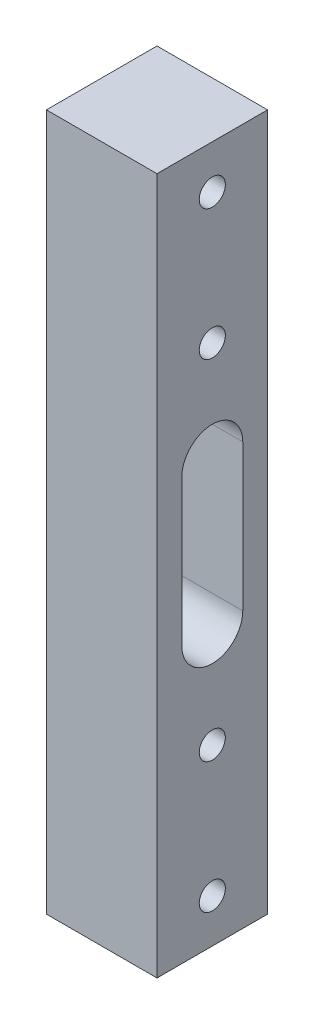
ISO-10303-21;
HEADER;
FILE_DESCRIPTION(('STEP AP214'),'2;1');
FILE_NAME('part.step','',(''),(''),'','','');
FILE_SCHEMA(('AUTOMOTIVE_DESIGN { 1 0 10303 214 1 1 1 1 }'));
ENDSEC;
DATA;
#1=APPLICATION_CONTEXT('core data for automotive mechanical design processes');
#2=APPLICATION_PROTOCOL_DEFINITION('international standard','automotive_design',2000,#1);
#3=PRODUCT_CONTEXT('',#1,'mechanical');
#4=PRODUCT('Part','Part','',(#3));
#5=PRODUCT_RELATED_PRODUCT_CATEGORY('part','',(#4));
#6=PRODUCT_DEFINITION_FORMATION('','',#4);
#7=PRODUCT_DEFINITION_CONTEXT('part definition',#1,'design');
#8=PRODUCT_DEFINITION('design','',#6,#7);
#9=PRODUCT_DEFINITION_SHAPE('','',#8);
#10=(LENGTH_UNIT() NAMED_UNIT(*) SI_UNIT(.MILLI.,.METRE.));
#11=(NAMED_UNIT(*) PLANE_ANGLE_UNIT() SI_UNIT($,.RADIAN.));
#12=(NAMED_UNIT(*) SI_UNIT($,.STERADIAN.) SOLID_ANGLE_UNIT());
#13=UNCERTAINTY_MEASURE_WITH_UNIT(LENGTH_MEASURE(1.E-05),#10,'distance_accuracy_value','');
#14=(GEOMETRIC_REPRESENTATION_CONTEXT(3) GLOBAL_UNCERTAINTY_ASSIGNED_CONTEXT((#13)) GLOBAL_UNIT_ASSIGNED_CONTEXT((#10,
#11,#12)) REPRESENTATION_CONTEXT('',''));
#15=CARTESIAN_POINT('',(0.,0.,0.));
#16=DIRECTION('',(0.,0.,1.));
#17=DIRECTION('',(1.,0.,0.));
#18=AXIS2_PLACEMENT_3D('',#15,#16,#17);
#19=CARTESIAN_POINT('',(280.436422298069,-4.67265995813977E-12,0.));
#20=DIRECTION('',(-1.,0.,0.));
#21=DIRECTION('',(0.,-1.,0.));
#22=AXIS2_PLACEMENT_3D('',#19,#20,#21);
#23=PLANE('',#22);
#24=CARTESIAN_POINT('',(280.436422298081,736.419008573429,-461.631063311423));
#25=DIRECTION('',(-1.,0.,0.));
#26=DIRECTION('',(0.,-1.,0.));
#27=AXIS2_PLACEMENT_3D('',#24,#25,#26);
#28=CIRCLE('',#27,1.50000000000002);
#29=CARTESIAN_POINT('',(280.436422298081,734.919008573429,-461.631063311423));
#30=VERTEX_POINT('',#29);
#31=EDGE_CURVE('E166',#30,#30,#28,.T.);
#32=ORIENTED_EDGE('',*,*,#31,.F.);
#33=EDGE_LOOP('',(#32));
#34=FACE_BOUND('',#33,.T.);
#35=CARTESIAN_POINT('',(280.436422298082,791.419008573429,-461.631063311423));
#36=DIRECTION('',(-1.,0.,0.));
#37=DIRECTION('',(0.,-1.,0.));
#38=AXIS2_PLACEMENT_3D('',#35,#36,#37);
#39=CIRCLE('',#38,1.49999999999999);
#40=CARTESIAN_POINT('',(280.436422298082,789.919008573429,-461.631063311423));
#41=VERTEX_POINT('',#40);
#42=EDGE_CURVE('E182',#41,#41,#39,.T.);
#43=ORIENTED_EDGE('',*,*,#42,.F.);
#44=EDGE_LOOP('',(#43));
#45=FACE_BOUND('',#44,.T.);
#46=DIRECTION('',(0.,-1.,0.));
#47=VECTOR('',#46,1.);
#48=CARTESIAN_POINT('',(280.436422298082,811.419008573429,-467.981063311423));
#49=LINE('',#48,#47);
#50=CARTESIAN_POINT('',(280.436422298082,811.419008573429,-467.981063311423));
#51=VERTEX_POINT('',#50);
#52=CARTESIAN_POINT('',(280.436422298081,731.419008573429,-467.981063311422));
#53=VERTEX_POINT('',#52);
#54=EDGE_CURVE('E190',#51,#53,#49,.T.);
#55=ORIENTED_EDGE('',*,*,#54,.T.);
#56=DIRECTION('',(0.,0.,1.));
#57=VECTOR('',#56,1.);
#58=CARTESIAN_POINT('',(280.436422298081,731.419008573429,-467.981063311422));
#59=LINE('',#58,#57);
#60=CARTESIAN_POINT('',(280.436422298081,731.419008573429,-455.281063311422));
#61=VERTEX_POINT('',#60);
#62=EDGE_CURVE('E194',#53,#61,#59,.T.);
#63=ORIENTED_EDGE('',*,*,#62,.T.);
#64=DIRECTION('',(0.,1.,0.));
#65=VECTOR('',#64,1.);
#66=CARTESIAN_POINT('',(280.436422298082,811.419008573429,-455.281063311422));
#67=LINE('',#66,#65);
#68=CARTESIAN_POINT('',(280.436422298082,811.419008573429,-455.281063311422));
#69=VERTEX_POINT('',#68);
#70=EDGE_CURVE('E198',#61,#69,#67,.T.);
#71=ORIENTED_EDGE('',*,*,#70,.T.);
#72=DIRECTION('',(0.,0.,-1.));
#73=VECTOR('',#72,1.);
#74=CARTESIAN_POINT('',(280.436422298082,811.419008573429,-467.981063311423));
#75=LINE('',#74,#73);
#76=EDGE_CURVE('E200',#69,#51,#75,.T.);
#77=ORIENTED_EDGE('',*,*,#76,.T.);
#78=EDGE_LOOP('',(#55,#63,#71,#77));
#79=FACE_BOUND('',#78,.T.);
#80=CARTESIAN_POINT('',(280.436422298082,806.419008573429,-461.631063311422));
#81=DIRECTION('',(-1.,0.,0.));
#82=DIRECTION('',(0.,-1.,0.));
#83=AXIS2_PLACEMENT_3D('',#80,#81,#82);
#84=CIRCLE('',#83,1.49999999999997);
#85=CARTESIAN_POINT('',(280.436422298082,804.919008573429,-461.631063311422));
#86=VERTEX_POINT('',#85);
#87=EDGE_CURVE('E174',#86,#86,#84,.T.);
#88=ORIENTED_EDGE('',*,*,#87,.F.);
#89=EDGE_LOOP('',(#88));
#90=FACE_BOUND('',#89,.T.);
#91=CARTESIAN_POINT('',(280.436422298081,751.419008573429,-461.631063311423));
#92=DIRECTION('',(-1.,0.,0.));
#93=DIRECTION('',(0.,-1.,0.));
#94=AXIS2_PLACEMENT_3D('',#91,#92,#93);
#95=CIRCLE('',#94,1.49999999999999);
#96=CARTESIAN_POINT('',(280.436422298081,749.919008573429,-461.631063311423));
#97=VERTEX_POINT('',#96);
#98=EDGE_CURVE('E158',#97,#97,#95,.T.);
#99=ORIENTED_EDGE('',*,*,#98,.F.);
#100=EDGE_LOOP('',(#99));
#101=FACE_BOUND('',#100,.T.);
#102=DIRECTION('',(0.,-1.,0.));
#103=VECTOR('',#102,1.);
#104=CARTESIAN_POINT('',(280.436422298082,779.824280891476,-465.131063311423));
#105=LINE('',#104,#103);
#106=CARTESIAN_POINT('',(280.436422298082,779.824280891476,-465.131063311423));
#107=VERTEX_POINT('',#106);
#108=CARTESIAN_POINT('',(280.436422298081,763.013736255382,-465.131063311422));
#109=VERTEX_POINT('',#108);
#110=EDGE_CURVE('E118',#107,#109,#105,.T.);
#111=ORIENTED_EDGE('',*,*,#110,.F.);
#112=CARTESIAN_POINT('',(280.436422298082,779.824280891476,-461.631063311422));
#113=DIRECTION('',(-1.,0.,0.));
#114=DIRECTION('',(0.,-1.,0.));
#115=AXIS2_PLACEMENT_3D('',#112,#113,#114);
#116=CIRCLE('',#115,3.5);
#117=CARTESIAN_POINT('',(280.436422298082,779.824280891476,-458.131063311423));
#118=VERTEX_POINT('',#117);
#119=EDGE_CURVE('E109',#118,#107,#116,.T.);
#120=ORIENTED_EDGE('',*,*,#119,.F.);
#121=DIRECTION('',(0.,1.,0.));
#122=VECTOR('',#121,1.);
#123=CARTESIAN_POINT('',(280.436422298082,779.824280891476,-458.131063311423));
#124=LINE('',#123,#122);
#125=CARTESIAN_POINT('',(280.436422298081,763.013736255382,-458.131063311423));
#126=VERTEX_POINT('',#125);
#127=EDGE_CURVE('E137',#126,#118,#124,.T.);
#128=ORIENTED_EDGE('',*,*,#127,.F.);
#129=CARTESIAN_POINT('',(280.436422298081,763.013736255382,-461.631063311422));
#130=DIRECTION('',(-1.,0.,0.));
#131=DIRECTION('',(0.,-1.,0.));
#132=AXIS2_PLACEMENT_3D('',#129,#130,#131);
#133=CIRCLE('',#132,3.5);
#134=EDGE_CURVE('E131',#109,#126,#133,.T.);
#135=ORIENTED_EDGE('',*,*,#134,.F.);
#136=EDGE_LOOP('',(#111,#120,#128,#135));
#137=FACE_BOUND('',#136,.T.);
#138=ADVANCED_FACE('F43',(#34,#45,#79,#90,#101,#137),#23,.T.);
#139=CARTESIAN_POINT('',(293.136422298069,-4.88170208087339E-12,0.));
#140=DIRECTION('',(-1.,0.,0.));
#141=DIRECTION('',(0.,-1.,0.));
#142=AXIS2_PLACEMENT_3D('',#139,#140,#141);
#143=PLANE('',#142);
#144=CARTESIAN_POINT('',(293.136422298081,751.419008573429,-461.631063311423));
#145=DIRECTION('',(-1.,0.,0.));
#146=DIRECTION('',(0.,-1.,0.));
#147=AXIS2_PLACEMENT_3D('',#144,#145,#146);
#148=CIRCLE('',#147,1.49999999999999);
#149=CARTESIAN_POINT('',(293.136422298081,749.919008573429,-461.631063311423));
#150=VERTEX_POINT('',#149);
#151=EDGE_CURVE('E127',#150,#150,#148,.T.);
#152=ORIENTED_EDGE('',*,*,#151,.T.);
#153=EDGE_LOOP('',(#152));
#154=FACE_BOUND('',#153,.T.);
#155=CARTESIAN_POINT('',(293.136422298081,736.419008573429,-461.631063311423));
#156=DIRECTION('',(-1.,0.,0.));
#157=DIRECTION('',(0.,-1.,0.));
#158=AXIS2_PLACEMENT_3D('',#155,#156,#157);
#159=CIRCLE('',#158,1.50000000000002);
#160=CARTESIAN_POINT('',(293.136422298081,734.919008573429,-461.631063311423));
#161=VERTEX_POINT('',#160);
#162=EDGE_CURVE('E162',#161,#161,#159,.T.);
#163=ORIENTED_EDGE('',*,*,#162,.T.);
#164=EDGE_LOOP('',(#163));
#165=FACE_BOUND('',#164,.T.);
#166=CARTESIAN_POINT('',(293.136422298082,806.419008573429,-461.631063311422));
#167=DIRECTION('',(-1.,0.,0.));
#168=DIRECTION('',(0.,-1.,0.));
#169=AXIS2_PLACEMENT_3D('',#166,#167,#168);
#170=CIRCLE('',#169,1.49999999999997);
#171=CARTESIAN_POINT('',(293.136422298082,804.919008573429,-461.631063311422));
#172=VERTEX_POINT('',#171);
#173=EDGE_CURVE('E170',#172,#172,#170,.T.);
#174=ORIENTED_EDGE('',*,*,#173,.T.);
#175=EDGE_LOOP('',(#174));
#176=FACE_BOUND('',#175,.T.);
#177=CARTESIAN_POINT('',(293.136422298082,791.419008573429,-461.631063311423));
#178=DIRECTION('',(-1.,0.,0.));
#179=DIRECTION('',(0.,-1.,0.));
#180=AXIS2_PLACEMENT_3D('',#177,#178,#179);
#181=CIRCLE('',#180,1.49999999999999);
#182=CARTESIAN_POINT('',(293.136422298082,789.919008573429,-461.631063311423));
#183=VERTEX_POINT('',#182);
#184=EDGE_CURVE('E178',#183,#183,#181,.T.);
#185=ORIENTED_EDGE('',*,*,#184,.T.);
#186=EDGE_LOOP('',(#185));
#187=FACE_BOUND('',#186,.T.);
#188=DIRECTION('',(0.,-1.,0.));
#189=VECTOR('',#188,1.);
#190=CARTESIAN_POINT('',(293.136422298082,811.419008573429,-467.981063311423));
#191=LINE('',#190,#189);
#192=CARTESIAN_POINT('',(293.136422298082,811.419008573429,-467.981063311423));
#193=VERTEX_POINT('',#192);
#194=CARTESIAN_POINT('',(293.136422298081,731.419008573429,-467.981063311422));
#195=VERTEX_POINT('',#194);
#196=EDGE_CURVE('E186',#193,#195,#191,.T.);
#197=ORIENTED_EDGE('',*,*,#196,.F.);
#198=DIRECTION('',(0.,0.,-1.));
#199=VECTOR('',#198,1.);
#200=CARTESIAN_POINT('',(293.136422298082,811.419008573429,-467.981063311423));
#201=LINE('',#200,#199);
#202=CARTESIAN_POINT('',(293.136422298082,811.419008573429,-455.281063311422));
#203=VERTEX_POINT('',#202);
#204=EDGE_CURVE('E195',#203,#193,#201,.T.);
#205=ORIENTED_EDGE('',*,*,#204,.F.);
#206=DIRECTION('',(0.,1.,0.));
#207=VECTOR('',#206,1.);
#208=CARTESIAN_POINT('',(293.136422298082,811.419008573429,-455.281063311422));
#209=LINE('',#208,#207);
#210=CARTESIAN_POINT('',(293.136422298081,731.419008573429,-455.281063311422));
#211=VERTEX_POINT('',#210);
#212=EDGE_CURVE('E210',#211,#203,#209,.T.);
#213=ORIENTED_EDGE('',*,*,#212,.F.);
#214=DIRECTION('',(0.,0.,1.));
#215=VECTOR('',#214,1.);
#216=CARTESIAN_POINT('',(293.136422298081,731.419008573429,-467.981063311422));
#217=LINE('',#216,#215);
#218=EDGE_CURVE('E207',#195,#211,#217,.T.);
#219=ORIENTED_EDGE('',*,*,#218,.F.);
#220=EDGE_LOOP('',(#197,#205,#213,#219));
#221=FACE_BOUND('',#220,.T.);
#222=CARTESIAN_POINT('',(293.136422298082,779.824280891476,-461.631063311422));
#223=DIRECTION('',(-1.,0.,0.));
#224=DIRECTION('',(0.,-1.,0.));
#225=AXIS2_PLACEMENT_3D('',#222,#223,#224);
#226=CIRCLE('',#225,3.5);
#227=CARTESIAN_POINT('',(293.136422298082,779.824280891476,-458.131063311423));
#228=VERTEX_POINT('',#227);
#229=CARTESIAN_POINT('',(293.136422298082,779.824280891476,-465.131063311423));
#230=VERTEX_POINT('',#229);
#231=EDGE_CURVE('E67',#228,#230,#226,.T.);
#232=ORIENTED_EDGE('',*,*,#231,.T.);
#233=DIRECTION('',(0.,-1.,0.));
#234=VECTOR('',#233,1.);
#235=CARTESIAN_POINT('',(293.136422298082,779.824280891476,-465.131063311423));
#236=LINE('',#235,#234);
#237=CARTESIAN_POINT('',(293.136422298081,763.013736255382,-465.131063311422));
#238=VERTEX_POINT('',#237);
#239=EDGE_CURVE('E125',#230,#238,#236,.T.);
#240=ORIENTED_EDGE('',*,*,#239,.T.);
#241=CARTESIAN_POINT('',(293.136422298081,763.013736255382,-461.631063311422));
#242=DIRECTION('',(-1.,0.,0.));
#243=DIRECTION('',(0.,-1.,0.));
#244=AXIS2_PLACEMENT_3D('',#241,#242,#243);
#245=CIRCLE('',#244,3.5);
#246=CARTESIAN_POINT('',(293.136422298081,763.013736255382,-458.131063311423));
#247=VERTEX_POINT('',#246);
#248=EDGE_CURVE('E145',#238,#247,#245,.T.);
#249=ORIENTED_EDGE('',*,*,#248,.T.);
#250=DIRECTION('',(0.,1.,0.));
#251=VECTOR('',#250,1.);
#252=CARTESIAN_POINT('',(293.136422298082,779.824280891476,-458.131063311423));
#253=LINE('',#252,#251);
#254=EDGE_CURVE('E119',#247,#228,#253,.T.);
#255=ORIENTED_EDGE('',*,*,#254,.T.);
#256=EDGE_LOOP('',(#232,#240,#249,#255));
#257=FACE_BOUND('',#256,.T.);
#258=ADVANCED_FACE('F233',(#154,#165,#176,#187,#221,#257),#143,.F.);
#259=CARTESIAN_POINT('',(280.436422298082,811.419008573429,-467.981063311423));
#260=DIRECTION('',(0.,0.,1.));
#261=DIRECTION('',(1.,0.,0.));
#262=AXIS2_PLACEMENT_3D('',#259,#260,#261);
#263=PLANE('',#262);
#264=ORIENTED_EDGE('',*,*,#196,.T.);
#265=DIRECTION('',(1.,0.,0.));
#266=VECTOR('',#265,1.);
#267=CARTESIAN_POINT('',(280.436422298081,731.419008573429,-467.981063311422));
#268=LINE('',#267,#266);
#269=EDGE_CURVE('E11',#53,#195,#268,.T.);
#270=ORIENTED_EDGE('',*,*,#269,.F.);
#271=ORIENTED_EDGE('',*,*,#54,.F.);
#272=DIRECTION('',(1.,0.,0.));
#273=VECTOR('',#272,1.);
#274=CARTESIAN_POINT('',(280.436422298082,811.419008573429,-467.981063311423));
#275=LINE('',#274,#273);
#276=EDGE_CURVE('E203',#51,#193,#275,.T.);
#277=ORIENTED_EDGE('',*,*,#276,.T.);
#278=EDGE_LOOP('',(#264,#270,#271,#277));
#279=FACE_BOUND('',#278,.T.);
#280=ADVANCED_FACE('F45',(#279),#263,.F.);
#281=CARTESIAN_POINT('',(280.436422298081,731.419008573429,-467.981063311422));
#282=DIRECTION('',(0.,1.,0.));
#283=DIRECTION('',(-1.,0.,0.));
#284=AXIS2_PLACEMENT_3D('',#281,#282,#283);
#285=PLANE('',#284);
#286=ORIENTED_EDGE('',*,*,#218,.T.);
#287=DIRECTION('',(1.,0.,0.));
#288=VECTOR('',#287,1.);
#289=CARTESIAN_POINT('',(280.436422298081,731.419008573429,-455.281063311422));
#290=LINE('',#289,#288);
#291=EDGE_CURVE('E52',#61,#211,#290,.T.);
#292=ORIENTED_EDGE('',*,*,#291,.F.);
#293=ORIENTED_EDGE('',*,*,#62,.F.);
#294=ORIENTED_EDGE('',*,*,#269,.T.);
#295=EDGE_LOOP('',(#286,#292,#293,#294));
#296=FACE_BOUND('',#295,.T.);
#297=ADVANCED_FACE('F244',(#296),#285,.F.);
#298=CARTESIAN_POINT('',(280.436422298082,811.419008573429,-455.281063311422));
#299=DIRECTION('',(0.,0.,-1.));
#300=DIRECTION('',(-1.,0.,0.));
#301=AXIS2_PLACEMENT_3D('',#298,#299,#300);
#302=PLANE('',#301);
#303=ORIENTED_EDGE('',*,*,#212,.T.);
#304=DIRECTION('',(1.,0.,0.));
#305=VECTOR('',#304,1.);
#306=CARTESIAN_POINT('',(280.436422298082,811.419008573429,-455.281063311422));
#307=LINE('',#306,#305);
#308=EDGE_CURVE('E218',#69,#203,#307,.T.);
#309=ORIENTED_EDGE('',*,*,#308,.F.);
#310=ORIENTED_EDGE('',*,*,#70,.F.);
#311=ORIENTED_EDGE('',*,*,#291,.T.);
#312=EDGE_LOOP('',(#303,#309,#310,#311));
#313=FACE_BOUND('',#312,.T.);
#314=ADVANCED_FACE('F227',(#313),#302,.F.);
#315=CARTESIAN_POINT('',(280.436422298082,811.419008573429,-467.981063311423));
#316=DIRECTION('',(0.,-1.,0.));
#317=DIRECTION('',(1.,0.,0.));
#318=AXIS2_PLACEMENT_3D('',#315,#316,#317);
#319=PLANE('',#318);
#320=ORIENTED_EDGE('',*,*,#204,.T.);
#321=ORIENTED_EDGE('',*,*,#276,.F.);
#322=ORIENTED_EDGE('',*,*,#76,.F.);
#323=ORIENTED_EDGE('',*,*,#308,.T.);
#324=EDGE_LOOP('',(#320,#321,#322,#323));
#325=FACE_BOUND('',#324,.T.);
#326=ADVANCED_FACE('F237',(#325),#319,.F.);
#327=CARTESIAN_POINT('',(280.436422298082,791.419008573429,-461.631063311423));
#328=DIRECTION('',(1.,0.,0.));
#329=DIRECTION('',(0.,1.,0.));
#330=AXIS2_PLACEMENT_3D('',#327,#328,#329);
#331=CYLINDRICAL_SURFACE('',#330,1.49999999999999);
#332=ORIENTED_EDGE('',*,*,#42,.T.);
#333=EDGE_LOOP('',(#332));
#334=FACE_BOUND('',#333,.T.);
#335=ORIENTED_EDGE('',*,*,#184,.F.);
#336=EDGE_LOOP('',(#335));
#337=FACE_BOUND('',#336,.T.);
#338=ADVANCED_FACE('F262',(#334,#337),#331,.F.);
#339=CARTESIAN_POINT('',(280.436422298082,806.419008573429,-461.631063311422));
#340=DIRECTION('',(1.,0.,0.));
#341=DIRECTION('',(0.,1.,0.));
#342=AXIS2_PLACEMENT_3D('',#339,#340,#341);
#343=CYLINDRICAL_SURFACE('',#342,1.49999999999997);
#344=ORIENTED_EDGE('',*,*,#87,.T.);
#345=EDGE_LOOP('',(#344));
#346=FACE_BOUND('',#345,.T.);
#347=ORIENTED_EDGE('',*,*,#173,.F.);
#348=EDGE_LOOP('',(#347));
#349=FACE_BOUND('',#348,.T.);
#350=ADVANCED_FACE('F269',(#346,#349),#343,.F.);
#351=CARTESIAN_POINT('',(280.436422298081,736.419008573429,-461.631063311423));
#352=DIRECTION('',(1.,0.,0.));
#353=DIRECTION('',(0.,1.,0.));
#354=AXIS2_PLACEMENT_3D('',#351,#352,#353);
#355=CYLINDRICAL_SURFACE('',#354,1.50000000000002);
#356=ORIENTED_EDGE('',*,*,#31,.T.);
#357=EDGE_LOOP('',(#356));
#358=FACE_BOUND('',#357,.T.);
#359=ORIENTED_EDGE('',*,*,#162,.F.);
#360=EDGE_LOOP('',(#359));
#361=FACE_BOUND('',#360,.T.);
#362=ADVANCED_FACE('F274',(#358,#361),#355,.F.);
#363=CARTESIAN_POINT('',(280.436422298081,751.419008573429,-461.631063311423));
#364=DIRECTION('',(1.,0.,0.));
#365=DIRECTION('',(0.,1.,0.));
#366=AXIS2_PLACEMENT_3D('',#363,#364,#365);
#367=CYLINDRICAL_SURFACE('',#366,1.49999999999999);
#368=ORIENTED_EDGE('',*,*,#98,.T.);
#369=EDGE_LOOP('',(#368));
#370=FACE_BOUND('',#369,.T.);
#371=ORIENTED_EDGE('',*,*,#151,.F.);
#372=EDGE_LOOP('',(#371));
#373=FACE_BOUND('',#372,.T.);
#374=ADVANCED_FACE('F283',(#370,#373),#367,.F.);
#375=CARTESIAN_POINT('',(280.436422298082,779.824280891476,-461.631063311422));
#376=DIRECTION('',(1.,0.,0.));
#377=DIRECTION('',(0.,1.,0.));
#378=AXIS2_PLACEMENT_3D('',#375,#376,#377);
#379=CYLINDRICAL_SURFACE('',#378,3.5);
#380=ORIENTED_EDGE('',*,*,#231,.F.);
#381=DIRECTION('',(1.,0.,0.));
#382=VECTOR('',#381,1.);
#383=CARTESIAN_POINT('',(280.436422298082,779.824280891476,-458.131063311423));
#384=LINE('',#383,#382);
#385=EDGE_CURVE('E113',#118,#228,#384,.T.);
#386=ORIENTED_EDGE('',*,*,#385,.F.);
#387=ORIENTED_EDGE('',*,*,#119,.T.);
#388=DIRECTION('',(1.,0.,0.));
#389=VECTOR('',#388,1.);
#390=CARTESIAN_POINT('',(280.436422298082,779.824280891476,-465.131063311423));
#391=LINE('',#390,#389);
#392=EDGE_CURVE('E112',#107,#230,#391,.T.);
#393=ORIENTED_EDGE('',*,*,#392,.T.);
#394=EDGE_LOOP('',(#380,#386,#387,#393));
#395=FACE_BOUND('',#394,.T.);
#396=ADVANCED_FACE('F111',(#395),#379,.F.);
#397=CARTESIAN_POINT('',(280.436422298082,779.824280891476,-465.131063311423));
#398=DIRECTION('',(0.,0.,1.));
#399=DIRECTION('',(1.,0.,0.));
#400=AXIS2_PLACEMENT_3D('',#397,#398,#399);
#401=PLANE('',#400);
#402=ORIENTED_EDGE('',*,*,#239,.F.);
#403=ORIENTED_EDGE('',*,*,#392,.F.);
#404=ORIENTED_EDGE('',*,*,#110,.T.);
#405=DIRECTION('',(1.,0.,0.));
#406=VECTOR('',#405,1.);
#407=CARTESIAN_POINT('',(280.436422298081,763.013736255382,-465.131063311422));
#408=LINE('',#407,#406);
#409=EDGE_CURVE('E128',#109,#238,#408,.T.);
#410=ORIENTED_EDGE('',*,*,#409,.T.);
#411=EDGE_LOOP('',(#402,#403,#404,#410));
#412=FACE_BOUND('',#411,.T.);
#413=ADVANCED_FACE('F122',(#412),#401,.T.);
#414=CARTESIAN_POINT('',(280.436422298081,763.013736255382,-461.631063311422));
#415=DIRECTION('',(1.,0.,0.));
#416=DIRECTION('',(0.,1.,0.));
#417=AXIS2_PLACEMENT_3D('',#414,#415,#416);
#418=CYLINDRICAL_SURFACE('',#417,3.5);
#419=ORIENTED_EDGE('',*,*,#248,.F.);
#420=ORIENTED_EDGE('',*,*,#409,.F.);
#421=ORIENTED_EDGE('',*,*,#134,.T.);
#422=DIRECTION('',(1.,0.,0.));
#423=VECTOR('',#422,1.);
#424=CARTESIAN_POINT('',(280.436422298081,763.013736255382,-458.131063311423));
#425=LINE('',#424,#423);
#426=EDGE_CURVE('E59',#126,#247,#425,.T.);
#427=ORIENTED_EDGE('',*,*,#426,.T.);
#428=EDGE_LOOP('',(#419,#420,#421,#427));
#429=FACE_BOUND('',#428,.T.);
#430=ADVANCED_FACE('F295',(#429),#418,.F.);
#431=CARTESIAN_POINT('',(280.436422298082,779.824280891476,-458.131063311423));
#432=DIRECTION('',(0.,0.,-1.));
#433=DIRECTION('',(-1.,0.,0.));
#434=AXIS2_PLACEMENT_3D('',#431,#432,#433);
#435=PLANE('',#434);
#436=ORIENTED_EDGE('',*,*,#254,.F.);
#437=ORIENTED_EDGE('',*,*,#426,.F.);
#438=ORIENTED_EDGE('',*,*,#127,.T.);
#439=ORIENTED_EDGE('',*,*,#385,.T.);
#440=EDGE_LOOP('',(#436,#437,#438,#439));
#441=FACE_BOUND('',#440,.T.);
#442=ADVANCED_FACE('F298',(#441),#435,.T.);
#443=CLOSED_SHELL('',(#138,#258,#280,#297,#314,#326,#338,#350,#362,#374,#396,#413,#430,#442));
#444=MANIFOLD_SOLID_BREP('B2',#443);
#445=ADVANCED_BREP_SHAPE_REPRESENTATION('',(#18,#444),#14);
#446=SHAPE_DEFINITION_REPRESENTATION(#9,#445);
ENDSEC;
END-ISO-10303-21;
